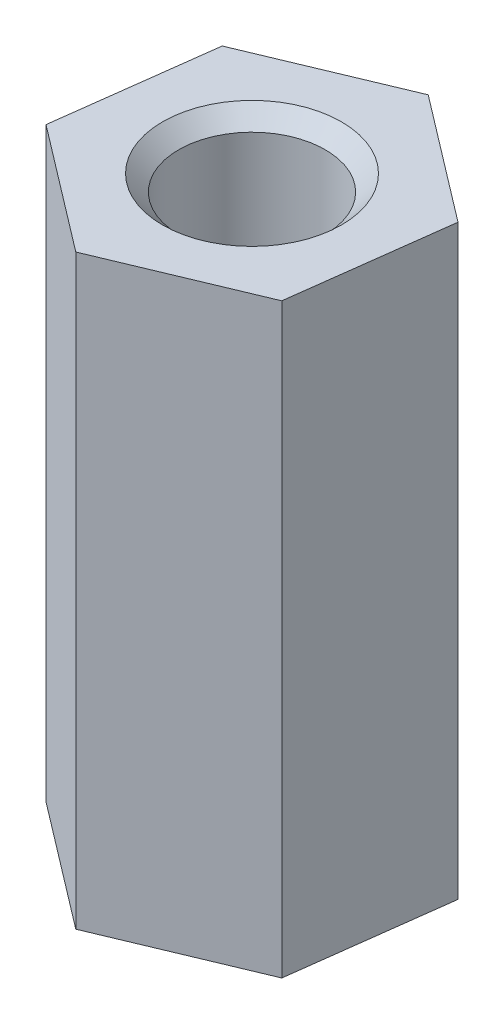
ISO-10303-21;
HEADER;
FILE_DESCRIPTION(('STEP AP214'),'2;1');
FILE_NAME('part.step','',(''),(''),'','','');
FILE_SCHEMA(('AUTOMOTIVE_DESIGN { 1 0 10303 214 1 1 1 1 }'));
ENDSEC;
DATA;
#1=APPLICATION_CONTEXT('core data for automotive mechanical design processes');
#2=APPLICATION_PROTOCOL_DEFINITION('international standard','automotive_design',2000,#1);
#3=PRODUCT_CONTEXT('',#1,'mechanical');
#4=PRODUCT('Part','Part','',(#3));
#5=PRODUCT_RELATED_PRODUCT_CATEGORY('part','',(#4));
#6=PRODUCT_DEFINITION_FORMATION('','',#4);
#7=PRODUCT_DEFINITION_CONTEXT('part definition',#1,'design');
#8=PRODUCT_DEFINITION('design','',#6,#7);
#9=PRODUCT_DEFINITION_SHAPE('','',#8);
#10=(LENGTH_UNIT() NAMED_UNIT(*) SI_UNIT(.MILLI.,.METRE.));
#11=(NAMED_UNIT(*) PLANE_ANGLE_UNIT() SI_UNIT($,.RADIAN.));
#12=(NAMED_UNIT(*) SI_UNIT($,.STERADIAN.) SOLID_ANGLE_UNIT());
#13=UNCERTAINTY_MEASURE_WITH_UNIT(LENGTH_MEASURE(1.E-05),#10,'distance_accuracy_value','');
#14=(GEOMETRIC_REPRESENTATION_CONTEXT(3) GLOBAL_UNCERTAINTY_ASSIGNED_CONTEXT((#13)) GLOBAL_UNIT_ASSIGNED_CONTEXT((#10,
#11,#12)) REPRESENTATION_CONTEXT('',''));
#15=CARTESIAN_POINT('',(0.,0.,0.));
#16=DIRECTION('',(0.,0.,1.));
#17=DIRECTION('',(1.,0.,0.));
#18=AXIS2_PLACEMENT_3D('',#15,#16,#17);
#19=CARTESIAN_POINT('',(-1.40932091650666,10.,1.84917266751832));
#20=DIRECTION('',(0.606159533981361,0.,-0.795343082803578));
#21=DIRECTION('',(-0.795343082803578,0.,-0.606159533981361));
#22=AXIS2_PLACEMENT_3D('',#19,#20,#21);
#23=PLANE('',#22);
#24=DIRECTION('',(0.795343082803578,0.,0.606159533981361));
#25=VECTOR('',#24,1.);
#26=CARTESIAN_POINT('',(-1.40932091650666,0.,1.84917266751832));
#27=LINE('',#26,#25);
#28=CARTESIAN_POINT('',(-2.47694125387647,0.,1.03550085699863));
#29=VERTEX_POINT('',#28);
#30=CARTESIAN_POINT('',(-0.341700579136865,0.,2.66284447803801));
#31=VERTEX_POINT('',#30);
#32=EDGE_CURVE('E125',#29,#31,#27,.T.);
#33=ORIENTED_EDGE('',*,*,#32,.T.);
#34=DIRECTION('',(0.,-1.,0.));
#35=VECTOR('',#34,1.);
#36=CARTESIAN_POINT('',(-0.341700579136865,10.,2.66284447803801));
#37=LINE('',#36,#35);
#38=CARTESIAN_POINT('',(-0.341700579136865,10.,2.66284447803801));
#39=VERTEX_POINT('',#38);
#40=EDGE_CURVE('E11',#39,#31,#37,.T.);
#41=ORIENTED_EDGE('',*,*,#40,.F.);
#42=DIRECTION('',(0.795343082803578,0.,0.606159533981361));
#43=VECTOR('',#42,1.);
#44=CARTESIAN_POINT('',(-1.40932091650666,10.,1.84917266751832));
#45=LINE('',#44,#43);
#46=CARTESIAN_POINT('',(-2.47694125387647,10.,1.03550085699863));
#47=VERTEX_POINT('',#46);
#48=EDGE_CURVE('E136',#47,#39,#45,.T.);
#49=ORIENTED_EDGE('',*,*,#48,.F.);
#50=DIRECTION('',(0.,-1.,0.));
#51=VECTOR('',#50,1.);
#52=CARTESIAN_POINT('',(-2.47694125387647,10.,1.03550085699863));
#53=LINE('',#52,#51);
#54=EDGE_CURVE('E121',#47,#29,#53,.T.);
#55=ORIENTED_EDGE('',*,*,#54,.T.);
#56=EDGE_LOOP('',(#33,#41,#49,#55));
#57=FACE_BOUND('',#56,.T.);
#58=ADVANCED_FACE('F41',(#57),#23,.F.);
#59=CARTESIAN_POINT('',(0.896770047801367,10.,2.1450940495387));
#60=DIRECTION('',(-0.385707547441448,0.,-0.922621096575784));
#61=DIRECTION('',(-0.922621096575785,0.,0.385707547441448));
#62=AXIS2_PLACEMENT_3D('',#59,#60,#61);
#63=PLANE('',#62);
#64=DIRECTION('',(0.922621096575785,0.,-0.385707547441448));
#65=VECTOR('',#64,1.);
#66=CARTESIAN_POINT('',(0.896770047801367,0.,2.1450940495387));
#67=LINE('',#66,#65);
#68=CARTESIAN_POINT('',(2.1352406747396,0.,1.62734362103939));
#69=VERTEX_POINT('',#68);
#70=EDGE_CURVE('E128',#31,#69,#67,.T.);
#71=ORIENTED_EDGE('',*,*,#70,.T.);
#72=DIRECTION('',(0.,-1.,0.));
#73=VECTOR('',#72,1.);
#74=CARTESIAN_POINT('',(2.1352406747396,10.,1.62734362103939));
#75=LINE('',#74,#73);
#76=CARTESIAN_POINT('',(2.1352406747396,10.,1.62734362103939));
#77=VERTEX_POINT('',#76);
#78=EDGE_CURVE('E49',#77,#69,#75,.T.);
#79=ORIENTED_EDGE('',*,*,#78,.F.);
#80=DIRECTION('',(0.922621096575785,0.,-0.385707547441448));
#81=VECTOR('',#80,1.);
#82=CARTESIAN_POINT('',(0.896770047801367,10.,2.1450940495387));
#83=LINE('',#82,#81);
#84=EDGE_CURVE('E94',#39,#77,#83,.T.);
#85=ORIENTED_EDGE('',*,*,#84,.F.);
#86=ORIENTED_EDGE('',*,*,#40,.T.);
#87=EDGE_LOOP('',(#71,#79,#85,#86));
#88=FACE_BOUND('',#87,.T.);
#89=ADVANCED_FACE('F161',(#88),#63,.F.);
#90=CARTESIAN_POINT('',(2.30609096430803,10.,0.295921382020381));
#91=DIRECTION('',(-0.991867081422809,0.,-0.127278013772207));
#92=DIRECTION('',(-0.127278013772207,0.,0.991867081422809));
#93=AXIS2_PLACEMENT_3D('',#90,#91,#92);
#94=PLANE('',#93);
#95=DIRECTION('',(0.127278013772207,0.,-0.991867081422809));
#96=VECTOR('',#95,1.);
#97=CARTESIAN_POINT('',(2.30609096430803,0.,0.295921382020381));
#98=LINE('',#97,#96);
#99=CARTESIAN_POINT('',(2.47694125387647,0.,-1.03550085699863));
#100=VERTEX_POINT('',#99);
#101=EDGE_CURVE('E131',#69,#100,#98,.T.);
#102=ORIENTED_EDGE('',*,*,#101,.T.);
#103=DIRECTION('',(0.,-1.,0.));
#104=VECTOR('',#103,1.);
#105=CARTESIAN_POINT('',(2.47694125387647,10.,-1.03550085699863));
#106=LINE('',#105,#104);
#107=CARTESIAN_POINT('',(2.47694125387647,10.,-1.03550085699863));
#108=VERTEX_POINT('',#107);
#109=EDGE_CURVE('E116',#108,#100,#106,.T.);
#110=ORIENTED_EDGE('',*,*,#109,.F.);
#111=DIRECTION('',(0.127278013772207,0.,-0.991867081422809));
#112=VECTOR('',#111,1.);
#113=CARTESIAN_POINT('',(2.30609096430803,10.,0.295921382020381));
#114=LINE('',#113,#112);
#115=EDGE_CURVE('E107',#77,#108,#114,.T.);
#116=ORIENTED_EDGE('',*,*,#115,.F.);
#117=ORIENTED_EDGE('',*,*,#78,.T.);
#118=EDGE_LOOP('',(#102,#110,#116,#117));
#119=FACE_BOUND('',#118,.T.);
#120=ADVANCED_FACE('F142',(#119),#94,.F.);
#121=CARTESIAN_POINT('',(1.40932091650666,10.,-1.84917266751832));
#122=DIRECTION('',(-0.606159533981361,0.,0.795343082803578));
#123=DIRECTION('',(0.795343082803578,0.,0.606159533981361));
#124=AXIS2_PLACEMENT_3D('',#121,#122,#123);
#125=PLANE('',#124);
#126=DIRECTION('',(-0.795343082803578,0.,-0.606159533981361));
#127=VECTOR('',#126,1.);
#128=CARTESIAN_POINT('',(1.40932091650666,0.,-1.84917266751832));
#129=LINE('',#128,#127);
#130=CARTESIAN_POINT('',(0.341700579136865,0.,-2.66284447803801));
#131=VERTEX_POINT('',#130);
#132=EDGE_CURVE('E115',#100,#131,#129,.T.);
#133=ORIENTED_EDGE('',*,*,#132,.T.);
#134=DIRECTION('',(0.,-1.,0.));
#135=VECTOR('',#134,1.);
#136=CARTESIAN_POINT('',(0.341700579136865,10.,-2.66284447803801));
#137=LINE('',#136,#135);
#138=CARTESIAN_POINT('',(0.341700579136865,10.,-2.66284447803801));
#139=VERTEX_POINT('',#138);
#140=EDGE_CURVE('E112',#139,#131,#137,.T.);
#141=ORIENTED_EDGE('',*,*,#140,.F.);
#142=DIRECTION('',(-0.795343082803578,0.,-0.606159533981361));
#143=VECTOR('',#142,1.);
#144=CARTESIAN_POINT('',(1.40932091650666,10.,-1.84917266751832));
#145=LINE('',#144,#143);
#146=EDGE_CURVE('E101',#108,#139,#145,.T.);
#147=ORIENTED_EDGE('',*,*,#146,.F.);
#148=ORIENTED_EDGE('',*,*,#109,.T.);
#149=EDGE_LOOP('',(#133,#141,#147,#148));
#150=FACE_BOUND('',#149,.T.);
#151=ADVANCED_FACE('F113',(#150),#125,.F.);
#152=CARTESIAN_POINT('',(-0.896770047801367,10.,-2.1450940495387));
#153=DIRECTION('',(0.385707547441448,0.,0.922621096575785));
#154=DIRECTION('',(0.922621096575785,0.,-0.385707547441448));
#155=AXIS2_PLACEMENT_3D('',#152,#153,#154);
#156=PLANE('',#155);
#157=DIRECTION('',(-0.922621096575785,0.,0.385707547441448));
#158=VECTOR('',#157,1.);
#159=CARTESIAN_POINT('',(-0.896770047801367,0.,-2.1450940495387));
#160=LINE('',#159,#158);
#161=CARTESIAN_POINT('',(-2.1352406747396,0.,-1.62734362103939));
#162=VERTEX_POINT('',#161);
#163=EDGE_CURVE('E80',#131,#162,#160,.T.);
#164=ORIENTED_EDGE('',*,*,#163,.T.);
#165=DIRECTION('',(0.,-1.,0.));
#166=VECTOR('',#165,1.);
#167=CARTESIAN_POINT('',(-2.1352406747396,10.,-1.62734362103939));
#168=LINE('',#167,#166);
#169=CARTESIAN_POINT('',(-2.1352406747396,10.,-1.62734362103939));
#170=VERTEX_POINT('',#169);
#171=EDGE_CURVE('E117',#170,#162,#168,.T.);
#172=ORIENTED_EDGE('',*,*,#171,.F.);
#173=DIRECTION('',(-0.922621096575785,0.,0.385707547441448));
#174=VECTOR('',#173,1.);
#175=CARTESIAN_POINT('',(-0.896770047801367,10.,-2.1450940495387));
#176=LINE('',#175,#174);
#177=EDGE_CURVE('E105',#139,#170,#176,.T.);
#178=ORIENTED_EDGE('',*,*,#177,.F.);
#179=ORIENTED_EDGE('',*,*,#140,.T.);
#180=EDGE_LOOP('',(#164,#172,#178,#179));
#181=FACE_BOUND('',#180,.T.);
#182=ADVANCED_FACE('F119',(#181),#156,.F.);
#183=CARTESIAN_POINT('',(-2.30609096430803,10.,-0.295921382020381));
#184=DIRECTION('',(0.991867081422809,0.,0.127278013772207));
#185=DIRECTION('',(0.127278013772207,0.,-0.991867081422809));
#186=AXIS2_PLACEMENT_3D('',#183,#184,#185);
#187=PLANE('',#186);
#188=DIRECTION('',(-0.127278013772207,0.,0.991867081422809));
#189=VECTOR('',#188,1.);
#190=CARTESIAN_POINT('',(-2.30609096430803,0.,-0.295921382020381));
#191=LINE('',#190,#189);
#192=EDGE_CURVE('E86',#162,#29,#191,.T.);
#193=ORIENTED_EDGE('',*,*,#192,.T.);
#194=ORIENTED_EDGE('',*,*,#54,.F.);
#195=DIRECTION('',(-0.127278013772207,0.,0.991867081422809));
#196=VECTOR('',#195,1.);
#197=CARTESIAN_POINT('',(-2.30609096430803,10.,-0.295921382020381));
#198=LINE('',#197,#196);
#199=EDGE_CURVE('E57',#170,#47,#198,.T.);
#200=ORIENTED_EDGE('',*,*,#199,.F.);
#201=ORIENTED_EDGE('',*,*,#171,.T.);
#202=EDGE_LOOP('',(#193,#194,#200,#201));
#203=FACE_BOUND('',#202,.T.);
#204=ADVANCED_FACE('F149',(#203),#187,.F.);
#205=CARTESIAN_POINT('',(0.,10.,0.));
#206=DIRECTION('',(0.,1.,0.));
#207=DIRECTION('',(0.,0.,1.));
#208=AXIS2_PLACEMENT_3D('',#205,#206,#207);
#209=PLANE('',#208);
#210=CARTESIAN_POINT('',(0.,10.,0.));
#211=DIRECTION('',(0.,1.,0.));
#212=DIRECTION('',(0.,0.,1.));
#213=AXIS2_PLACEMENT_3D('',#210,#211,#212);
#214=CIRCLE('',#213,1.525);
#215=CARTESIAN_POINT('',(0.,10.,1.525));
#216=VERTEX_POINT('',#215);
#217=EDGE_CURVE('E233',#216,#216,#214,.T.);
#218=ORIENTED_EDGE('',*,*,#217,.F.);
#219=EDGE_LOOP('',(#218));
#220=FACE_BOUND('',#219,.T.);
#221=ORIENTED_EDGE('',*,*,#48,.T.);
#222=ORIENTED_EDGE('',*,*,#84,.T.);
#223=ORIENTED_EDGE('',*,*,#115,.T.);
#224=ORIENTED_EDGE('',*,*,#146,.T.);
#225=ORIENTED_EDGE('',*,*,#177,.T.);
#226=ORIENTED_EDGE('',*,*,#199,.T.);
#227=EDGE_LOOP('',(#221,#222,#223,#224,#225,#226));
#228=FACE_BOUND('',#227,.T.);
#229=ADVANCED_FACE('F103',(#220,#228),#209,.T.);
#230=CARTESIAN_POINT('',(0.,0.,0.));
#231=DIRECTION('',(0.,1.,0.));
#232=DIRECTION('',(0.,0.,1.));
#233=AXIS2_PLACEMENT_3D('',#230,#231,#232);
#234=PLANE('',#233);
#235=CARTESIAN_POINT('',(0.,0.,0.));
#236=DIRECTION('',(0.,1.,0.));
#237=DIRECTION('',(0.,0.,1.));
#238=AXIS2_PLACEMENT_3D('',#235,#236,#237);
#239=CIRCLE('',#238,1.25);
#240=CARTESIAN_POINT('',(0.,0.,1.25));
#241=VERTEX_POINT('',#240);
#242=EDGE_CURVE('E129',#241,#241,#239,.T.);
#243=ORIENTED_EDGE('',*,*,#242,.T.);
#244=EDGE_LOOP('',(#243));
#245=FACE_BOUND('',#244,.T.);
#246=ORIENTED_EDGE('',*,*,#32,.F.);
#247=ORIENTED_EDGE('',*,*,#192,.F.);
#248=ORIENTED_EDGE('',*,*,#163,.F.);
#249=ORIENTED_EDGE('',*,*,#132,.F.);
#250=ORIENTED_EDGE('',*,*,#101,.F.);
#251=ORIENTED_EDGE('',*,*,#70,.F.);
#252=EDGE_LOOP('',(#246,#247,#248,#249,#250,#251));
#253=FACE_BOUND('',#252,.T.);
#254=ADVANCED_FACE('F145',(#245,#253),#234,.F.);
#255=CARTESIAN_POINT('',(0.,10.,0.));
#256=DIRECTION('',(0.,1.,0.));
#257=DIRECTION('',(0.,0.,1.));
#258=AXIS2_PLACEMENT_3D('',#255,#256,#257);
#259=CYLINDRICAL_SURFACE('',#258,1.25);
#260=ORIENTED_EDGE('',*,*,#242,.F.);
#261=EDGE_LOOP('',(#260));
#262=FACE_BOUND('',#261,.T.);
#263=CARTESIAN_POINT('',(0.,9.725,0.));
#264=DIRECTION('',(0.,1.,0.));
#265=DIRECTION('',(0.,0.,1.));
#266=AXIS2_PLACEMENT_3D('',#263,#264,#265);
#267=CIRCLE('',#266,1.25);
#268=CARTESIAN_POINT('',(0.,9.725,1.25));
#269=VERTEX_POINT('',#268);
#270=EDGE_CURVE('E230',#269,#269,#267,.T.);
#271=ORIENTED_EDGE('',*,*,#270,.T.);
#272=EDGE_LOOP('',(#271));
#273=FACE_BOUND('',#272,.T.);
#274=ADVANCED_FACE('F198',(#262,#273),#259,.F.);
#275=CARTESIAN_POINT('',(0.,10.,0.));
#276=DIRECTION('',(0.,1.,0.));
#277=DIRECTION('',(0.,0.,1.));
#278=AXIS2_PLACEMENT_3D('',#275,#276,#277);
#279=CONICAL_SURFACE('',#278,1.525,0.785398163397446);
#280=ORIENTED_EDGE('',*,*,#270,.F.);
#281=EDGE_LOOP('',(#280));
#282=FACE_BOUND('',#281,.T.);
#283=ORIENTED_EDGE('',*,*,#217,.T.);
#284=EDGE_LOOP('',(#283));
#285=FACE_BOUND('',#284,.T.);
#286=ADVANCED_FACE('F208',(#282,#285),#279,.F.);
#287=CLOSED_SHELL('',(#58,#89,#120,#151,#182,#204,#229,#254,#274,#286));
#288=MANIFOLD_SOLID_BREP('B2',#287);
#289=ADVANCED_BREP_SHAPE_REPRESENTATION('',(#18,#288),#14);
#290=SHAPE_DEFINITION_REPRESENTATION(#9,#289);
ENDSEC;
END-ISO-10303-21;
